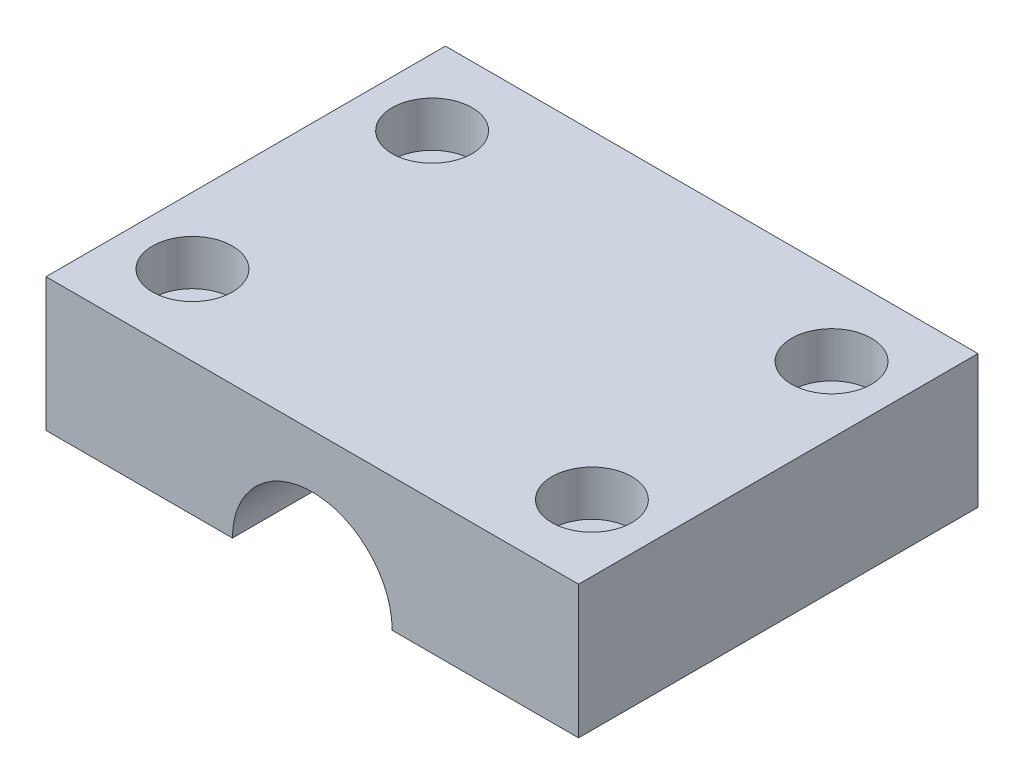
ISO-10303-21;
HEADER;
FILE_DESCRIPTION(('STEP AP214'),'2;1');
FILE_NAME('part.step','',(''),(''),'','','');
FILE_SCHEMA(('AUTOMOTIVE_DESIGN { 1 0 10303 214 1 1 1 1 }'));
ENDSEC;
DATA;
#1=APPLICATION_CONTEXT('core data for automotive mechanical design processes');
#2=APPLICATION_PROTOCOL_DEFINITION('international standard','automotive_design',2000,#1);
#3=PRODUCT_CONTEXT('',#1,'mechanical');
#4=PRODUCT('Part','Part','',(#3));
#5=PRODUCT_RELATED_PRODUCT_CATEGORY('part','',(#4));
#6=PRODUCT_DEFINITION_FORMATION('','',#4);
#7=PRODUCT_DEFINITION_CONTEXT('part definition',#1,'design');
#8=PRODUCT_DEFINITION('design','',#6,#7);
#9=PRODUCT_DEFINITION_SHAPE('','',#8);
#10=(LENGTH_UNIT() NAMED_UNIT(*) SI_UNIT(.MILLI.,.METRE.));
#11=(NAMED_UNIT(*) PLANE_ANGLE_UNIT() SI_UNIT($,.RADIAN.));
#12=(NAMED_UNIT(*) SI_UNIT($,.STERADIAN.) SOLID_ANGLE_UNIT());
#13=UNCERTAINTY_MEASURE_WITH_UNIT(LENGTH_MEASURE(1.E-05),#10,'distance_accuracy_value','');
#14=(GEOMETRIC_REPRESENTATION_CONTEXT(3) GLOBAL_UNCERTAINTY_ASSIGNED_CONTEXT((#13)) GLOBAL_UNIT_ASSIGNED_CONTEXT((#10,
#11,#12)) REPRESENTATION_CONTEXT('',''));
#15=CARTESIAN_POINT('',(0.,0.,0.));
#16=DIRECTION('',(0.,0.,1.));
#17=DIRECTION('',(1.,0.,0.));
#18=AXIS2_PLACEMENT_3D('',#15,#16,#17);
#19=CARTESIAN_POINT('',(0.,0.,0.));
#20=DIRECTION('',(0.,-1.,0.));
#21=DIRECTION('',(0.,0.,-1.));
#22=AXIS2_PLACEMENT_3D('',#19,#20,#21);
#23=PLANE('',#22);
#24=CARTESIAN_POINT('',(35.,0.,-24.));
#25=DIRECTION('',(0.,1.,0.));
#26=DIRECTION('',(0.,0.,1.));
#27=AXIS2_PLACEMENT_3D('',#24,#25,#26);
#28=CIRCLE('',#27,1.6);
#29=CARTESIAN_POINT('',(35.,0.,-22.4));
#30=VERTEX_POINT('',#29);
#31=EDGE_CURVE('E189',#30,#30,#28,.T.);
#32=ORIENTED_EDGE('',*,*,#31,.T.);
#33=EDGE_LOOP('',(#32));
#34=FACE_BOUND('',#33,.T.);
#35=CARTESIAN_POINT('',(35.0000000000001,0.,-6.));
#36=DIRECTION('',(0.,1.,0.));
#37=DIRECTION('',(0.,0.,1.));
#38=AXIS2_PLACEMENT_3D('',#35,#36,#37);
#39=CIRCLE('',#38,1.6);
#40=CARTESIAN_POINT('',(35.0000000000001,0.,-4.4));
#41=VERTEX_POINT('',#40);
#42=EDGE_CURVE('E150',#41,#41,#39,.T.);
#43=ORIENTED_EDGE('',*,*,#42,.T.);
#44=EDGE_LOOP('',(#43));
#45=FACE_BOUND('',#44,.T.);
#46=DIRECTION('',(0.,0.,1.));
#47=VECTOR('',#46,1.);
#48=CARTESIAN_POINT('',(26.,0.,-30.));
#49=LINE('',#48,#47);
#50=CARTESIAN_POINT('',(26.,0.,-30.));
#51=VERTEX_POINT('',#50);
#52=CARTESIAN_POINT('',(26.,0.,0.));
#53=VERTEX_POINT('',#52);
#54=EDGE_CURVE('E110',#51,#53,#49,.T.);
#55=ORIENTED_EDGE('',*,*,#54,.F.);
#56=DIRECTION('',(-1.,0.,0.));
#57=VECTOR('',#56,1.);
#58=CARTESIAN_POINT('',(0.,0.,-30.));
#59=LINE('',#58,#57);
#60=CARTESIAN_POINT('',(40.,0.,-30.));
#61=VERTEX_POINT('',#60);
#62=EDGE_CURVE('E116',#61,#51,#59,.T.);
#63=ORIENTED_EDGE('',*,*,#62,.F.);
#64=DIRECTION('',(0.,0.,-1.));
#65=VECTOR('',#64,1.);
#66=CARTESIAN_POINT('',(40.,0.,0.));
#67=LINE('',#66,#65);
#68=CARTESIAN_POINT('',(40.,0.,0.));
#69=VERTEX_POINT('',#68);
#70=EDGE_CURVE('E122',#69,#61,#67,.T.);
#71=ORIENTED_EDGE('',*,*,#70,.F.);
#72=DIRECTION('',(1.,0.,0.));
#73=VECTOR('',#72,1.);
#74=CARTESIAN_POINT('',(0.,0.,0.));
#75=LINE('',#74,#73);
#76=EDGE_CURVE('E141',#53,#69,#75,.T.);
#77=ORIENTED_EDGE('',*,*,#76,.F.);
#78=EDGE_LOOP('',(#55,#63,#71,#77));
#79=FACE_BOUND('',#78,.T.);
#80=ADVANCED_FACE('F45',(#34,#45,#79),#23,.T.);
#81=CARTESIAN_POINT('',(0.,10.,0.));
#82=DIRECTION('',(1.,0.,0.));
#83=DIRECTION('',(0.,0.,-1.));
#84=AXIS2_PLACEMENT_3D('',#81,#82,#83);
#85=PLANE('',#84);
#86=DIRECTION('',(0.,0.,1.));
#87=VECTOR('',#86,1.);
#88=CARTESIAN_POINT('',(0.,0.,0.));
#89=LINE('',#88,#87);
#90=CARTESIAN_POINT('',(0.,0.,-30.));
#91=VERTEX_POINT('',#90);
#92=CARTESIAN_POINT('',(0.,0.,0.));
#93=VERTEX_POINT('',#92);
#94=EDGE_CURVE('E121',#91,#93,#89,.T.);
#95=ORIENTED_EDGE('',*,*,#94,.T.);
#96=DIRECTION('',(0.,-1.,0.));
#97=VECTOR('',#96,1.);
#98=CARTESIAN_POINT('',(0.,10.,0.));
#99=LINE('',#98,#97);
#100=CARTESIAN_POINT('',(0.,10.,0.));
#101=VERTEX_POINT('',#100);
#102=EDGE_CURVE('E11',#101,#93,#99,.T.);
#103=ORIENTED_EDGE('',*,*,#102,.F.);
#104=DIRECTION('',(0.,0.,1.));
#105=VECTOR('',#104,1.);
#106=CARTESIAN_POINT('',(0.,10.,0.));
#107=LINE('',#106,#105);
#108=CARTESIAN_POINT('',(0.,10.,-30.));
#109=VERTEX_POINT('',#108);
#110=EDGE_CURVE('E124',#109,#101,#107,.T.);
#111=ORIENTED_EDGE('',*,*,#110,.F.);
#112=DIRECTION('',(0.,-1.,0.));
#113=VECTOR('',#112,1.);
#114=CARTESIAN_POINT('',(0.,10.,-30.));
#115=LINE('',#114,#113);
#116=EDGE_CURVE('E129',#109,#91,#115,.T.);
#117=ORIENTED_EDGE('',*,*,#116,.T.);
#118=EDGE_LOOP('',(#95,#103,#111,#117));
#119=FACE_BOUND('',#118,.T.);
#120=ADVANCED_FACE('F47',(#119),#85,.F.);
#121=CARTESIAN_POINT('',(0.,10.,0.));
#122=DIRECTION('',(0.,0.,-1.));
#123=DIRECTION('',(-1.,0.,0.));
#124=AXIS2_PLACEMENT_3D('',#121,#122,#123);
#125=PLANE('',#124);
#126=CARTESIAN_POINT('',(14.,0.,0.));
#127=VERTEX_POINT('',#126);
#128=EDGE_CURVE('E125',#93,#127,#75,.T.);
#129=ORIENTED_EDGE('',*,*,#128,.T.);
#130=CARTESIAN_POINT('',(20.,0.,0.));
#131=DIRECTION('',(0.,0.,1.));
#132=DIRECTION('',(-1.,0.,0.));
#133=AXIS2_PLACEMENT_3D('',#130,#131,#132);
#134=CIRCLE('',#133,6.);
#135=EDGE_CURVE('E60',#53,#127,#134,.T.);
#136=ORIENTED_EDGE('',*,*,#135,.F.);
#137=ORIENTED_EDGE('',*,*,#76,.T.);
#138=DIRECTION('',(0.,-1.,0.));
#139=VECTOR('',#138,1.);
#140=CARTESIAN_POINT('',(40.,10.,0.));
#141=LINE('',#140,#139);
#142=CARTESIAN_POINT('',(40.,10.,0.));
#143=VERTEX_POINT('',#142);
#144=EDGE_CURVE('E53',#143,#69,#141,.T.);
#145=ORIENTED_EDGE('',*,*,#144,.F.);
#146=DIRECTION('',(1.,0.,0.));
#147=VECTOR('',#146,1.);
#148=CARTESIAN_POINT('',(0.,10.,0.));
#149=LINE('',#148,#147);
#150=EDGE_CURVE('E97',#101,#143,#149,.T.);
#151=ORIENTED_EDGE('',*,*,#150,.F.);
#152=ORIENTED_EDGE('',*,*,#102,.T.);
#153=EDGE_LOOP('',(#129,#136,#137,#145,#151,#152));
#154=FACE_BOUND('',#153,.T.);
#155=ADVANCED_FACE('F149',(#154),#125,.F.);
#156=CARTESIAN_POINT('',(40.,10.,0.));
#157=DIRECTION('',(-1.,0.,0.));
#158=DIRECTION('',(0.,0.,1.));
#159=AXIS2_PLACEMENT_3D('',#156,#157,#158);
#160=PLANE('',#159);
#161=ORIENTED_EDGE('',*,*,#70,.T.);
#162=DIRECTION('',(0.,-1.,0.));
#163=VECTOR('',#162,1.);
#164=CARTESIAN_POINT('',(40.,10.,-30.));
#165=LINE('',#164,#163);
#166=CARTESIAN_POINT('',(40.,10.,-30.));
#167=VERTEX_POINT('',#166);
#168=EDGE_CURVE('E131',#167,#61,#165,.T.);
#169=ORIENTED_EDGE('',*,*,#168,.F.);
#170=DIRECTION('',(0.,0.,-1.));
#171=VECTOR('',#170,1.);
#172=CARTESIAN_POINT('',(40.,10.,0.));
#173=LINE('',#172,#171);
#174=EDGE_CURVE('E138',#143,#167,#173,.T.);
#175=ORIENTED_EDGE('',*,*,#174,.F.);
#176=ORIENTED_EDGE('',*,*,#144,.T.);
#177=EDGE_LOOP('',(#161,#169,#175,#176));
#178=FACE_BOUND('',#177,.T.);
#179=ADVANCED_FACE('F136',(#178),#160,.F.);
#180=CARTESIAN_POINT('',(0.,10.,-30.));
#181=DIRECTION('',(0.,0.,1.));
#182=DIRECTION('',(1.,0.,0.));
#183=AXIS2_PLACEMENT_3D('',#180,#181,#182);
#184=PLANE('',#183);
#185=ORIENTED_EDGE('',*,*,#62,.T.);
#186=CARTESIAN_POINT('',(20.,0.,-30.));
#187=DIRECTION('',(0.,0.,1.));
#188=DIRECTION('',(-1.,0.,0.));
#189=AXIS2_PLACEMENT_3D('',#186,#187,#188);
#190=CIRCLE('',#189,6.);
#191=CARTESIAN_POINT('',(14.,0.,-30.));
#192=VERTEX_POINT('',#191);
#193=EDGE_CURVE('E106',#51,#192,#190,.T.);
#194=ORIENTED_EDGE('',*,*,#193,.T.);
#195=EDGE_CURVE('E90',#192,#91,#59,.T.);
#196=ORIENTED_EDGE('',*,*,#195,.T.);
#197=ORIENTED_EDGE('',*,*,#116,.F.);
#198=DIRECTION('',(-1.,0.,0.));
#199=VECTOR('',#198,1.);
#200=CARTESIAN_POINT('',(0.,10.,-30.));
#201=LINE('',#200,#199);
#202=EDGE_CURVE('E69',#167,#109,#201,.T.);
#203=ORIENTED_EDGE('',*,*,#202,.F.);
#204=ORIENTED_EDGE('',*,*,#168,.T.);
#205=EDGE_LOOP('',(#185,#194,#196,#197,#203,#204));
#206=FACE_BOUND('',#205,.T.);
#207=ADVANCED_FACE('F113',(#206),#184,.F.);
#208=CARTESIAN_POINT('',(0.,10.,0.));
#209=DIRECTION('',(0.,-1.,0.));
#210=DIRECTION('',(0.,0.,-1.));
#211=AXIS2_PLACEMENT_3D('',#208,#209,#210);
#212=PLANE('',#211);
#213=CARTESIAN_POINT('',(35.,10.,-24.));
#214=DIRECTION('',(0.,1.,0.));
#215=DIRECTION('',(0.,0.,1.));
#216=AXIS2_PLACEMENT_3D('',#213,#214,#215);
#217=CIRCLE('',#216,3.);
#218=CARTESIAN_POINT('',(35.,10.,-21.));
#219=VERTEX_POINT('',#218);
#220=EDGE_CURVE('E198',#219,#219,#217,.T.);
#221=ORIENTED_EDGE('',*,*,#220,.F.);
#222=EDGE_LOOP('',(#221));
#223=FACE_BOUND('',#222,.T.);
#224=CARTESIAN_POINT('',(5.,10.,-24.));
#225=DIRECTION('',(0.,1.,0.));
#226=DIRECTION('',(0.,0.,1.));
#227=AXIS2_PLACEMENT_3D('',#224,#225,#226);
#228=CIRCLE('',#227,3.);
#229=CARTESIAN_POINT('',(5.,10.,-21.));
#230=VERTEX_POINT('',#229);
#231=EDGE_CURVE('E186',#230,#230,#228,.T.);
#232=ORIENTED_EDGE('',*,*,#231,.F.);
#233=EDGE_LOOP('',(#232));
#234=FACE_BOUND('',#233,.T.);
#235=CARTESIAN_POINT('',(5.00000000000007,10.,-6.));
#236=DIRECTION('',(0.,1.,0.));
#237=DIRECTION('',(0.,0.,1.));
#238=AXIS2_PLACEMENT_3D('',#235,#236,#237);
#239=CIRCLE('',#238,3.);
#240=CARTESIAN_POINT('',(5.00000000000007,10.,-3.00000000000001));
#241=VERTEX_POINT('',#240);
#242=EDGE_CURVE('E174',#241,#241,#239,.T.);
#243=ORIENTED_EDGE('',*,*,#242,.F.);
#244=EDGE_LOOP('',(#243));
#245=FACE_BOUND('',#244,.T.);
#246=CARTESIAN_POINT('',(35.0000000000001,10.,-6.));
#247=DIRECTION('',(0.,1.,0.));
#248=DIRECTION('',(0.,0.,1.));
#249=AXIS2_PLACEMENT_3D('',#246,#247,#248);
#250=CIRCLE('',#249,3.);
#251=CARTESIAN_POINT('',(35.0000000000001,10.,-3.00000000000001));
#252=VERTEX_POINT('',#251);
#253=EDGE_CURVE('E162',#252,#252,#250,.T.);
#254=ORIENTED_EDGE('',*,*,#253,.F.);
#255=EDGE_LOOP('',(#254));
#256=FACE_BOUND('',#255,.T.);
#257=ORIENTED_EDGE('',*,*,#110,.T.);
#258=ORIENTED_EDGE('',*,*,#150,.T.);
#259=ORIENTED_EDGE('',*,*,#174,.T.);
#260=ORIENTED_EDGE('',*,*,#202,.T.);
#261=EDGE_LOOP('',(#257,#258,#259,#260));
#262=FACE_BOUND('',#261,.T.);
#263=ADVANCED_FACE('F204',(#223,#234,#245,#256,#262),#212,.F.);
#264=CARTESIAN_POINT('',(5.,0.,-24.));
#265=DIRECTION('',(0.,1.,0.));
#266=DIRECTION('',(0.,0.,1.));
#267=AXIS2_PLACEMENT_3D('',#264,#265,#266);
#268=CIRCLE('',#267,1.6);
#269=CARTESIAN_POINT('',(5.,0.,-22.4));
#270=VERTEX_POINT('',#269);
#271=EDGE_CURVE('E177',#270,#270,#268,.T.);
#272=ORIENTED_EDGE('',*,*,#271,.T.);
#273=EDGE_LOOP('',(#272));
#274=FACE_BOUND('',#273,.T.);
#275=CARTESIAN_POINT('',(5.00000000000007,0.,-6.));
#276=DIRECTION('',(0.,1.,0.));
#277=DIRECTION('',(0.,0.,1.));
#278=AXIS2_PLACEMENT_3D('',#275,#276,#277);
#279=CIRCLE('',#278,1.6);
#280=CARTESIAN_POINT('',(5.00000000000007,0.,-4.4));
#281=VERTEX_POINT('',#280);
#282=EDGE_CURVE('E165',#281,#281,#279,.T.);
#283=ORIENTED_EDGE('',*,*,#282,.T.);
#284=EDGE_LOOP('',(#283));
#285=FACE_BOUND('',#284,.T.);
#286=DIRECTION('',(0.,0.,1.));
#287=VECTOR('',#286,1.);
#288=CARTESIAN_POINT('',(14.,0.,-30.));
#289=LINE('',#288,#287);
#290=EDGE_CURVE('E104',#192,#127,#289,.T.);
#291=ORIENTED_EDGE('',*,*,#290,.T.);
#292=ORIENTED_EDGE('',*,*,#128,.F.);
#293=ORIENTED_EDGE('',*,*,#94,.F.);
#294=ORIENTED_EDGE('',*,*,#195,.F.);
#295=EDGE_LOOP('',(#291,#292,#293,#294));
#296=FACE_BOUND('',#295,.T.);
#297=ADVANCED_FACE('F119',(#274,#285,#296),#23,.T.);
#298=CARTESIAN_POINT('',(20.,0.,-30.));
#299=DIRECTION('',(0.,0.,1.));
#300=DIRECTION('',(1.,0.,0.));
#301=AXIS2_PLACEMENT_3D('',#298,#299,#300);
#302=CYLINDRICAL_SURFACE('',#301,6.);
#303=ORIENTED_EDGE('',*,*,#135,.T.);
#304=ORIENTED_EDGE('',*,*,#290,.F.);
#305=ORIENTED_EDGE('',*,*,#193,.F.);
#306=ORIENTED_EDGE('',*,*,#54,.T.);
#307=EDGE_LOOP('',(#303,#304,#305,#306));
#308=FACE_BOUND('',#307,.T.);
#309=ADVANCED_FACE('F105',(#308),#302,.F.);
#310=CARTESIAN_POINT('',(35.0000000000001,10.,-6.));
#311=DIRECTION('',(0.,1.,0.));
#312=DIRECTION('',(0.,0.,1.));
#313=AXIS2_PLACEMENT_3D('',#310,#311,#312);
#314=CYLINDRICAL_SURFACE('',#313,1.6);
#315=ORIENTED_EDGE('',*,*,#42,.F.);
#316=EDGE_LOOP('',(#315));
#317=FACE_BOUND('',#316,.T.);
#318=CARTESIAN_POINT('',(35.0000000000001,6.6,-6.));
#319=DIRECTION('',(0.,1.,0.));
#320=DIRECTION('',(0.,0.,1.));
#321=AXIS2_PLACEMENT_3D('',#318,#319,#320);
#322=CIRCLE('',#321,1.60000000000001);
#323=CARTESIAN_POINT('',(35.0000000000001,6.6,-4.39999999999999));
#324=VERTEX_POINT('',#323);
#325=EDGE_CURVE('E152',#324,#324,#322,.T.);
#326=ORIENTED_EDGE('',*,*,#325,.T.);
#327=EDGE_LOOP('',(#326));
#328=FACE_BOUND('',#327,.T.);
#329=ADVANCED_FACE('F233',(#317,#328),#314,.F.);
#330=CARTESIAN_POINT('',(36.6000000000001,6.6,-6.));
#331=DIRECTION('',(0.,-1.,0.));
#332=DIRECTION('',(0.,0.,-1.));
#333=AXIS2_PLACEMENT_3D('',#330,#331,#332);
#334=PLANE('',#333);
#335=ORIENTED_EDGE('',*,*,#325,.F.);
#336=EDGE_LOOP('',(#335));
#337=FACE_BOUND('',#336,.T.);
#338=CARTESIAN_POINT('',(35.0000000000001,6.6,-6.));
#339=DIRECTION('',(0.,1.,0.));
#340=DIRECTION('',(0.,0.,1.));
#341=AXIS2_PLACEMENT_3D('',#338,#339,#340);
#342=CIRCLE('',#341,3.);
#343=CARTESIAN_POINT('',(35.0000000000001,6.6,-3.00000000000001));
#344=VERTEX_POINT('',#343);
#345=EDGE_CURVE('E157',#344,#344,#342,.T.);
#346=ORIENTED_EDGE('',*,*,#345,.T.);
#347=EDGE_LOOP('',(#346));
#348=FACE_BOUND('',#347,.T.);
#349=ADVANCED_FACE('F267',(#337,#348),#334,.F.);
#350=CARTESIAN_POINT('',(35.0000000000001,10.,-6.));
#351=DIRECTION('',(0.,1.,0.));
#352=DIRECTION('',(0.,0.,1.));
#353=AXIS2_PLACEMENT_3D('',#350,#351,#352);
#354=CYLINDRICAL_SURFACE('',#353,3.);
#355=ORIENTED_EDGE('',*,*,#345,.F.);
#356=EDGE_LOOP('',(#355));
#357=FACE_BOUND('',#356,.T.);
#358=ORIENTED_EDGE('',*,*,#253,.T.);
#359=EDGE_LOOP('',(#358));
#360=FACE_BOUND('',#359,.T.);
#361=ADVANCED_FACE('F243',(#357,#360),#354,.F.);
#362=CARTESIAN_POINT('',(5.00000000000007,10.,-6.));
#363=DIRECTION('',(0.,1.,0.));
#364=DIRECTION('',(0.,0.,1.));
#365=AXIS2_PLACEMENT_3D('',#362,#363,#364);
#366=CYLINDRICAL_SURFACE('',#365,1.6);
#367=ORIENTED_EDGE('',*,*,#282,.F.);
#368=EDGE_LOOP('',(#367));
#369=FACE_BOUND('',#368,.T.);
#370=CARTESIAN_POINT('',(5.00000000000007,6.6,-6.));
#371=DIRECTION('',(0.,1.,0.));
#372=DIRECTION('',(0.,0.,1.));
#373=AXIS2_PLACEMENT_3D('',#370,#371,#372);
#374=CIRCLE('',#373,1.60000000000001);
#375=CARTESIAN_POINT('',(5.00000000000007,6.6,-4.39999999999999));
#376=VERTEX_POINT('',#375);
#377=EDGE_CURVE('E168',#376,#376,#374,.T.);
#378=ORIENTED_EDGE('',*,*,#377,.T.);
#379=EDGE_LOOP('',(#378));
#380=FACE_BOUND('',#379,.T.);
#381=ADVANCED_FACE('F239',(#369,#380),#366,.F.);
#382=CARTESIAN_POINT('',(6.60000000000008,6.6,-6.));
#383=DIRECTION('',(0.,-1.,0.));
#384=DIRECTION('',(0.,0.,-1.));
#385=AXIS2_PLACEMENT_3D('',#382,#383,#384);
#386=PLANE('',#385);
#387=ORIENTED_EDGE('',*,*,#377,.F.);
#388=EDGE_LOOP('',(#387));
#389=FACE_BOUND('',#388,.T.);
#390=CARTESIAN_POINT('',(5.00000000000007,6.6,-6.));
#391=DIRECTION('',(0.,1.,0.));
#392=DIRECTION('',(0.,0.,1.));
#393=AXIS2_PLACEMENT_3D('',#390,#391,#392);
#394=CIRCLE('',#393,3.);
#395=CARTESIAN_POINT('',(5.00000000000007,6.6,-3.00000000000001));
#396=VERTEX_POINT('',#395);
#397=EDGE_CURVE('E171',#396,#396,#394,.T.);
#398=ORIENTED_EDGE('',*,*,#397,.T.);
#399=EDGE_LOOP('',(#398));
#400=FACE_BOUND('',#399,.T.);
#401=ADVANCED_FACE('F242',(#389,#400),#386,.F.);
#402=CARTESIAN_POINT('',(5.00000000000007,10.,-6.));
#403=DIRECTION('',(0.,1.,0.));
#404=DIRECTION('',(0.,0.,1.));
#405=AXIS2_PLACEMENT_3D('',#402,#403,#404);
#406=CYLINDRICAL_SURFACE('',#405,3.);
#407=ORIENTED_EDGE('',*,*,#397,.F.);
#408=EDGE_LOOP('',(#407));
#409=FACE_BOUND('',#408,.T.);
#410=ORIENTED_EDGE('',*,*,#242,.T.);
#411=EDGE_LOOP('',(#410));
#412=FACE_BOUND('',#411,.T.);
#413=ADVANCED_FACE('F249',(#409,#412),#406,.F.);
#414=CARTESIAN_POINT('',(5.,10.,-24.));
#415=DIRECTION('',(0.,1.,0.));
#416=DIRECTION('',(0.,0.,1.));
#417=AXIS2_PLACEMENT_3D('',#414,#415,#416);
#418=CYLINDRICAL_SURFACE('',#417,1.6);
#419=ORIENTED_EDGE('',*,*,#271,.F.);
#420=EDGE_LOOP('',(#419));
#421=FACE_BOUND('',#420,.T.);
#422=CARTESIAN_POINT('',(5.,6.6,-24.));
#423=DIRECTION('',(0.,1.,0.));
#424=DIRECTION('',(0.,0.,1.));
#425=AXIS2_PLACEMENT_3D('',#422,#423,#424);
#426=CIRCLE('',#425,1.60000000000001);
#427=CARTESIAN_POINT('',(5.,6.6,-22.4));
#428=VERTEX_POINT('',#427);
#429=EDGE_CURVE('E180',#428,#428,#426,.T.);
#430=ORIENTED_EDGE('',*,*,#429,.T.);
#431=EDGE_LOOP('',(#430));
#432=FACE_BOUND('',#431,.T.);
#433=ADVANCED_FACE('F255',(#421,#432),#418,.F.);
#434=CARTESIAN_POINT('',(6.60000000000002,6.6,-24.));
#435=DIRECTION('',(0.,-1.,0.));
#436=DIRECTION('',(0.,0.,-1.));
#437=AXIS2_PLACEMENT_3D('',#434,#435,#436);
#438=PLANE('',#437);
#439=ORIENTED_EDGE('',*,*,#429,.F.);
#440=EDGE_LOOP('',(#439));
#441=FACE_BOUND('',#440,.T.);
#442=CARTESIAN_POINT('',(5.,6.6,-24.));
#443=DIRECTION('',(0.,1.,0.));
#444=DIRECTION('',(0.,0.,1.));
#445=AXIS2_PLACEMENT_3D('',#442,#443,#444);
#446=CIRCLE('',#445,3.);
#447=CARTESIAN_POINT('',(5.,6.6,-21.));
#448=VERTEX_POINT('',#447);
#449=EDGE_CURVE('E183',#448,#448,#446,.T.);
#450=ORIENTED_EDGE('',*,*,#449,.T.);
#451=EDGE_LOOP('',(#450));
#452=FACE_BOUND('',#451,.T.);
#453=ADVANCED_FACE('F260',(#441,#452),#438,.F.);
#454=CARTESIAN_POINT('',(5.,10.,-24.));
#455=DIRECTION('',(0.,1.,0.));
#456=DIRECTION('',(0.,0.,1.));
#457=AXIS2_PLACEMENT_3D('',#454,#455,#456);
#458=CYLINDRICAL_SURFACE('',#457,3.);
#459=ORIENTED_EDGE('',*,*,#449,.F.);
#460=EDGE_LOOP('',(#459));
#461=FACE_BOUND('',#460,.T.);
#462=ORIENTED_EDGE('',*,*,#231,.T.);
#463=EDGE_LOOP('',(#462));
#464=FACE_BOUND('',#463,.T.);
#465=ADVANCED_FACE('F333',(#461,#464),#458,.F.);
#466=CARTESIAN_POINT('',(35.,10.,-24.));
#467=DIRECTION('',(0.,1.,0.));
#468=DIRECTION('',(0.,0.,1.));
#469=AXIS2_PLACEMENT_3D('',#466,#467,#468);
#470=CYLINDRICAL_SURFACE('',#469,1.6);
#471=ORIENTED_EDGE('',*,*,#31,.F.);
#472=EDGE_LOOP('',(#471));
#473=FACE_BOUND('',#472,.T.);
#474=CARTESIAN_POINT('',(35.,6.6,-24.));
#475=DIRECTION('',(0.,1.,0.));
#476=DIRECTION('',(0.,0.,1.));
#477=AXIS2_PLACEMENT_3D('',#474,#475,#476);
#478=CIRCLE('',#477,1.60000000000001);
#479=CARTESIAN_POINT('',(35.,6.6,-22.4));
#480=VERTEX_POINT('',#479);
#481=EDGE_CURVE('E192',#480,#480,#478,.T.);
#482=ORIENTED_EDGE('',*,*,#481,.T.);
#483=EDGE_LOOP('',(#482));
#484=FACE_BOUND('',#483,.T.);
#485=ADVANCED_FACE('F344',(#473,#484),#470,.F.);
#486=CARTESIAN_POINT('',(36.6,6.6,-24.));
#487=DIRECTION('',(0.,-1.,0.));
#488=DIRECTION('',(0.,0.,-1.));
#489=AXIS2_PLACEMENT_3D('',#486,#487,#488);
#490=PLANE('',#489);
#491=ORIENTED_EDGE('',*,*,#481,.F.);
#492=EDGE_LOOP('',(#491));
#493=FACE_BOUND('',#492,.T.);
#494=CARTESIAN_POINT('',(35.,6.6,-24.));
#495=DIRECTION('',(0.,1.,0.));
#496=DIRECTION('',(0.,0.,1.));
#497=AXIS2_PLACEMENT_3D('',#494,#495,#496);
#498=CIRCLE('',#497,3.);
#499=CARTESIAN_POINT('',(35.,6.6,-21.));
#500=VERTEX_POINT('',#499);
#501=EDGE_CURVE('E195',#500,#500,#498,.T.);
#502=ORIENTED_EDGE('',*,*,#501,.T.);
#503=EDGE_LOOP('',(#502));
#504=FACE_BOUND('',#503,.T.);
#505=ADVANCED_FACE('F356',(#493,#504),#490,.F.);
#506=CARTESIAN_POINT('',(35.,10.,-24.));
#507=DIRECTION('',(0.,1.,0.));
#508=DIRECTION('',(0.,0.,1.));
#509=AXIS2_PLACEMENT_3D('',#506,#507,#508);
#510=CYLINDRICAL_SURFACE('',#509,3.);
#511=ORIENTED_EDGE('',*,*,#501,.F.);
#512=EDGE_LOOP('',(#511));
#513=FACE_BOUND('',#512,.T.);
#514=ORIENTED_EDGE('',*,*,#220,.T.);
#515=EDGE_LOOP('',(#514));
#516=FACE_BOUND('',#515,.T.);
#517=ADVANCED_FACE('F202',(#513,#516),#510,.F.);
#518=CLOSED_SHELL('',(#80,#120,#155,#179,#207,#263,#297,#309,#329,#349,#361,#381,#401,#413,#433,
#453,#465,#485,#505,#517));
#519=MANIFOLD_SOLID_BREP('B2',#518);
#520=ADVANCED_BREP_SHAPE_REPRESENTATION('',(#18,#519),#14);
#521=SHAPE_DEFINITION_REPRESENTATION(#9,#520);
ENDSEC;
END-ISO-10303-21;
